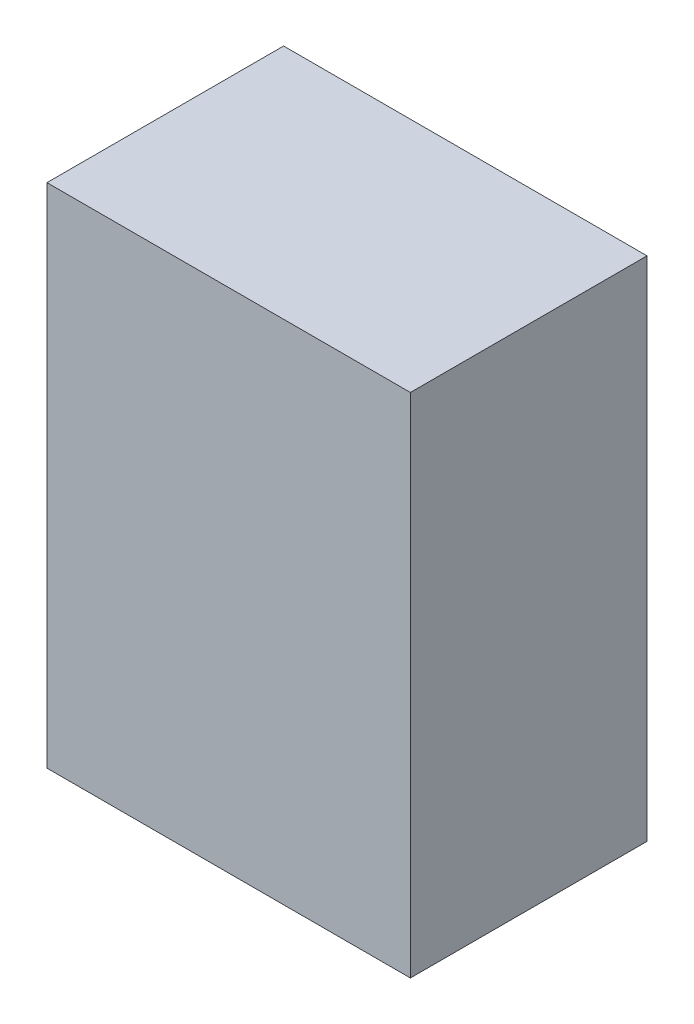
ISO-10303-21;
HEADER;
FILE_DESCRIPTION(('STEP AP214'),'2;1');
FILE_NAME('part.step','',(''),(''),'','','');
FILE_SCHEMA(('AUTOMOTIVE_DESIGN { 1 0 10303 214 1 1 1 1 }'));
ENDSEC;
DATA;
#1=APPLICATION_CONTEXT('core data for automotive mechanical design processes');
#2=APPLICATION_PROTOCOL_DEFINITION('international standard','automotive_design',2000,#1);
#3=PRODUCT_CONTEXT('',#1,'mechanical');
#4=PRODUCT('Part','Part','',(#3));
#5=PRODUCT_RELATED_PRODUCT_CATEGORY('part','',(#4));
#6=PRODUCT_DEFINITION_FORMATION('','',#4);
#7=PRODUCT_DEFINITION_CONTEXT('part definition',#1,'design');
#8=PRODUCT_DEFINITION('design','',#6,#7);
#9=PRODUCT_DEFINITION_SHAPE('','',#8);
#10=(LENGTH_UNIT() NAMED_UNIT(*) SI_UNIT(.MILLI.,.METRE.));
#11=(NAMED_UNIT(*) PLANE_ANGLE_UNIT() SI_UNIT($,.RADIAN.));
#12=(NAMED_UNIT(*) SI_UNIT($,.STERADIAN.) SOLID_ANGLE_UNIT());
#13=UNCERTAINTY_MEASURE_WITH_UNIT(LENGTH_MEASURE(1.E-05),#10,'distance_accuracy_value','');
#14=(GEOMETRIC_REPRESENTATION_CONTEXT(3) GLOBAL_UNCERTAINTY_ASSIGNED_CONTEXT((#13)) GLOBAL_UNIT_ASSIGNED_CONTEXT((#10,
#11,#12)) REPRESENTATION_CONTEXT('',''));
#15=CARTESIAN_POINT('',(0.,0.,0.));
#16=DIRECTION('',(0.,0.,1.));
#17=DIRECTION('',(1.,0.,0.));
#18=AXIS2_PLACEMENT_3D('',#15,#16,#17);
#19=CARTESIAN_POINT('',(0.,762.,0.));
#20=DIRECTION('',(1.,0.,0.));
#21=DIRECTION('',(0.,0.,-1.));
#22=AXIS2_PLACEMENT_3D('',#19,#20,#21);
#23=PLANE('',#22);
#24=DIRECTION('',(0.,0.,1.));
#25=VECTOR('',#24,1.);
#26=CARTESIAN_POINT('',(0.,0.,0.));
#27=LINE('',#26,#25);
#28=CARTESIAN_POINT('',(0.,0.,-355.6));
#29=VERTEX_POINT('',#28);
#30=CARTESIAN_POINT('',(0.,0.,0.));
#31=VERTEX_POINT('',#30);
#32=EDGE_CURVE('E94',#29,#31,#27,.T.);
#33=ORIENTED_EDGE('',*,*,#32,.T.);
#34=DIRECTION('',(0.,-1.,0.));
#35=VECTOR('',#34,1.);
#36=CARTESIAN_POINT('',(0.,762.,0.));
#37=LINE('',#36,#35);
#38=CARTESIAN_POINT('',(0.,762.,0.));
#39=VERTEX_POINT('',#38);
#40=EDGE_CURVE('E11',#39,#31,#37,.T.);
#41=ORIENTED_EDGE('',*,*,#40,.F.);
#42=DIRECTION('',(0.,0.,1.));
#43=VECTOR('',#42,1.);
#44=CARTESIAN_POINT('',(0.,762.,0.));
#45=LINE('',#44,#43);
#46=CARTESIAN_POINT('',(0.,762.,-355.6));
#47=VERTEX_POINT('',#46);
#48=EDGE_CURVE('E82',#47,#39,#45,.T.);
#49=ORIENTED_EDGE('',*,*,#48,.F.);
#50=DIRECTION('',(0.,-1.,0.));
#51=VECTOR('',#50,1.);
#52=CARTESIAN_POINT('',(0.,762.,-355.6));
#53=LINE('',#52,#51);
#54=EDGE_CURVE('E90',#47,#29,#53,.T.);
#55=ORIENTED_EDGE('',*,*,#54,.T.);
#56=EDGE_LOOP('',(#33,#41,#49,#55));
#57=FACE_BOUND('',#56,.T.);
#58=ADVANCED_FACE('F31',(#57),#23,.F.);
#59=CARTESIAN_POINT('',(0.,762.,0.));
#60=DIRECTION('',(0.,0.,-1.));
#61=DIRECTION('',(-1.,0.,0.));
#62=AXIS2_PLACEMENT_3D('',#59,#60,#61);
#63=PLANE('',#62);
#64=DIRECTION('',(1.,0.,0.));
#65=VECTOR('',#64,1.);
#66=CARTESIAN_POINT('',(0.,0.,0.));
#67=LINE('',#66,#65);
#68=CARTESIAN_POINT('',(546.1,0.,0.));
#69=VERTEX_POINT('',#68);
#70=EDGE_CURVE('E86',#31,#69,#67,.T.);
#71=ORIENTED_EDGE('',*,*,#70,.T.);
#72=DIRECTION('',(0.,-1.,0.));
#73=VECTOR('',#72,1.);
#74=CARTESIAN_POINT('',(546.1,762.,0.));
#75=LINE('',#74,#73);
#76=CARTESIAN_POINT('',(546.1,762.,0.));
#77=VERTEX_POINT('',#76);
#78=EDGE_CURVE('E39',#77,#69,#75,.T.);
#79=ORIENTED_EDGE('',*,*,#78,.F.);
#80=DIRECTION('',(1.,0.,0.));
#81=VECTOR('',#80,1.);
#82=CARTESIAN_POINT('',(0.,762.,0.));
#83=LINE('',#82,#81);
#84=EDGE_CURVE('E77',#39,#77,#83,.T.);
#85=ORIENTED_EDGE('',*,*,#84,.F.);
#86=ORIENTED_EDGE('',*,*,#40,.T.);
#87=EDGE_LOOP('',(#71,#79,#85,#86));
#88=FACE_BOUND('',#87,.T.);
#89=ADVANCED_FACE('F85',(#88),#63,.F.);
#90=CARTESIAN_POINT('',(546.1,762.,0.));
#91=DIRECTION('',(-1.,0.,0.));
#92=DIRECTION('',(0.,0.,1.));
#93=AXIS2_PLACEMENT_3D('',#90,#91,#92);
#94=PLANE('',#93);
#95=DIRECTION('',(0.,0.,-1.));
#96=VECTOR('',#95,1.);
#97=CARTESIAN_POINT('',(546.1,0.,0.));
#98=LINE('',#97,#96);
#99=CARTESIAN_POINT('',(546.1,0.,-355.6));
#100=VERTEX_POINT('',#99);
#101=EDGE_CURVE('E64',#69,#100,#98,.T.);
#102=ORIENTED_EDGE('',*,*,#101,.T.);
#103=DIRECTION('',(0.,-1.,0.));
#104=VECTOR('',#103,1.);
#105=CARTESIAN_POINT('',(546.1,762.,-355.6));
#106=LINE('',#105,#104);
#107=CARTESIAN_POINT('',(546.1,762.,-355.6));
#108=VERTEX_POINT('',#107);
#109=EDGE_CURVE('E87',#108,#100,#106,.T.);
#110=ORIENTED_EDGE('',*,*,#109,.F.);
#111=DIRECTION('',(0.,0.,-1.));
#112=VECTOR('',#111,1.);
#113=CARTESIAN_POINT('',(546.1,762.,0.));
#114=LINE('',#113,#112);
#115=EDGE_CURVE('E80',#77,#108,#114,.T.);
#116=ORIENTED_EDGE('',*,*,#115,.F.);
#117=ORIENTED_EDGE('',*,*,#78,.T.);
#118=EDGE_LOOP('',(#102,#110,#116,#117));
#119=FACE_BOUND('',#118,.T.);
#120=ADVANCED_FACE('F88',(#119),#94,.F.);
#121=CARTESIAN_POINT('',(0.,762.,-355.6));
#122=DIRECTION('',(0.,0.,1.));
#123=DIRECTION('',(1.,0.,0.));
#124=AXIS2_PLACEMENT_3D('',#121,#122,#123);
#125=PLANE('',#124);
#126=DIRECTION('',(-1.,0.,0.));
#127=VECTOR('',#126,1.);
#128=CARTESIAN_POINT('',(0.,0.,-355.6));
#129=LINE('',#128,#127);
#130=EDGE_CURVE('E70',#100,#29,#129,.T.);
#131=ORIENTED_EDGE('',*,*,#130,.T.);
#132=ORIENTED_EDGE('',*,*,#54,.F.);
#133=DIRECTION('',(-1.,0.,0.));
#134=VECTOR('',#133,1.);
#135=CARTESIAN_POINT('',(0.,762.,-355.6));
#136=LINE('',#135,#134);
#137=EDGE_CURVE('E47',#108,#47,#136,.T.);
#138=ORIENTED_EDGE('',*,*,#137,.F.);
#139=ORIENTED_EDGE('',*,*,#109,.T.);
#140=EDGE_LOOP('',(#131,#132,#138,#139));
#141=FACE_BOUND('',#140,.T.);
#142=ADVANCED_FACE('F101',(#141),#125,.F.);
#143=CARTESIAN_POINT('',(0.,762.,-355.6));
#144=DIRECTION('',(0.,-1.,0.));
#145=DIRECTION('',(0.,0.,-1.));
#146=AXIS2_PLACEMENT_3D('',#143,#144,#145);
#147=PLANE('',#146);
#148=ORIENTED_EDGE('',*,*,#48,.T.);
#149=ORIENTED_EDGE('',*,*,#84,.T.);
#150=ORIENTED_EDGE('',*,*,#115,.T.);
#151=ORIENTED_EDGE('',*,*,#137,.T.);
#152=EDGE_LOOP('',(#148,#149,#150,#151));
#153=FACE_BOUND('',#152,.T.);
#154=ADVANCED_FACE('F78',(#153),#147,.F.);
#155=CARTESIAN_POINT('',(0.,0.,-355.6));
#156=DIRECTION('',(0.,-1.,0.));
#157=DIRECTION('',(0.,0.,-1.));
#158=AXIS2_PLACEMENT_3D('',#155,#156,#157);
#159=PLANE('',#158);
#160=ORIENTED_EDGE('',*,*,#32,.F.);
#161=ORIENTED_EDGE('',*,*,#130,.F.);
#162=ORIENTED_EDGE('',*,*,#101,.F.);
#163=ORIENTED_EDGE('',*,*,#70,.F.);
#164=EDGE_LOOP('',(#160,#161,#162,#163));
#165=FACE_BOUND('',#164,.T.);
#166=ADVANCED_FACE('F104',(#165),#159,.T.);
#167=CLOSED_SHELL('',(#58,#89,#120,#142,#154,#166));
#168=MANIFOLD_SOLID_BREP('B2',#167);
#169=ADVANCED_BREP_SHAPE_REPRESENTATION('',(#18,#168),#14);
#170=SHAPE_DEFINITION_REPRESENTATION(#9,#169);
ENDSEC;
END-ISO-10303-21;
